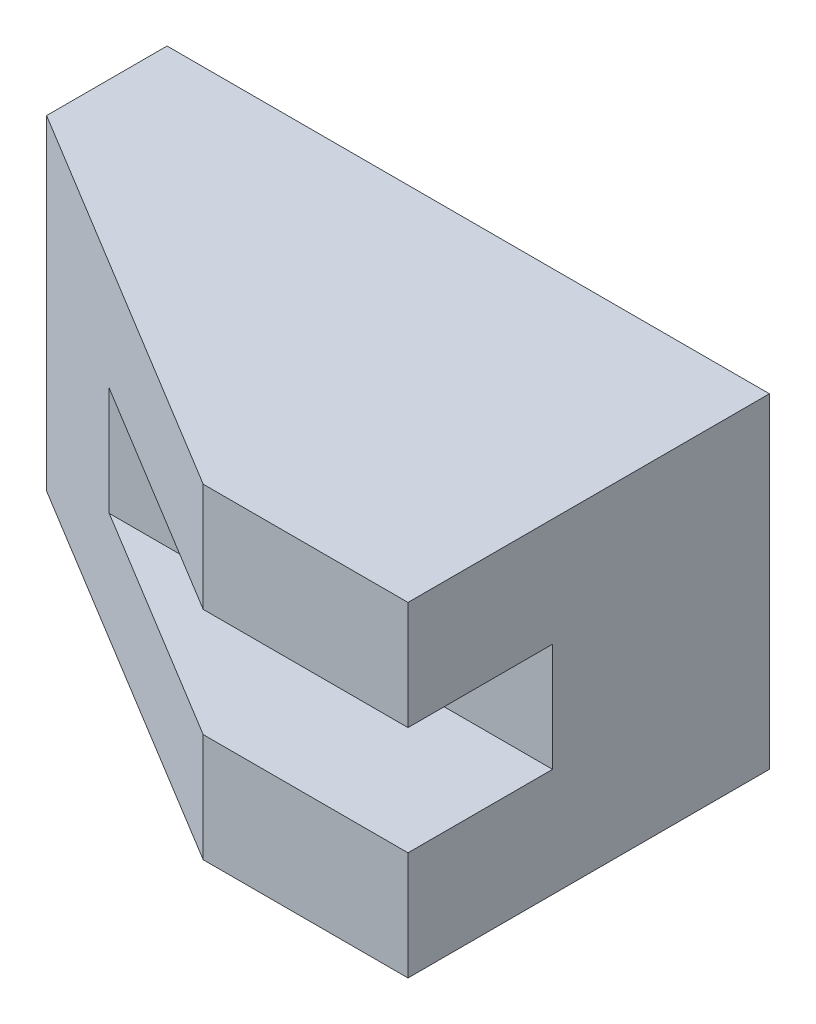
ISO-10303-21;
HEADER;
FILE_DESCRIPTION(('STEP AP214'),'2;1');
FILE_NAME('part.step','',(''),(''),'','','');
FILE_SCHEMA(('AUTOMOTIVE_DESIGN { 1 0 10303 214 1 1 1 1 }'));
ENDSEC;
DATA;
#1=APPLICATION_CONTEXT('core data for automotive mechanical design processes');
#2=APPLICATION_PROTOCOL_DEFINITION('international standard','automotive_design',2000,#1);
#3=PRODUCT_CONTEXT('',#1,'mechanical');
#4=PRODUCT('Part','Part','',(#3));
#5=PRODUCT_RELATED_PRODUCT_CATEGORY('part','',(#4));
#6=PRODUCT_DEFINITION_FORMATION('','',#4);
#7=PRODUCT_DEFINITION_CONTEXT('part definition',#1,'design');
#8=PRODUCT_DEFINITION('design','',#6,#7);
#9=PRODUCT_DEFINITION_SHAPE('','',#8);
#10=(LENGTH_UNIT() NAMED_UNIT(*) SI_UNIT(.MILLI.,.METRE.));
#11=(NAMED_UNIT(*) PLANE_ANGLE_UNIT() SI_UNIT($,.RADIAN.));
#12=(NAMED_UNIT(*) SI_UNIT($,.STERADIAN.) SOLID_ANGLE_UNIT());
#13=UNCERTAINTY_MEASURE_WITH_UNIT(LENGTH_MEASURE(1.E-05),#10,'distance_accuracy_value','');
#14=(GEOMETRIC_REPRESENTATION_CONTEXT(3) GLOBAL_UNCERTAINTY_ASSIGNED_CONTEXT((#13)) GLOBAL_UNIT_ASSIGNED_CONTEXT((#10,
#11,#12)) REPRESENTATION_CONTEXT('',''));
#15=CARTESIAN_POINT('',(0.,0.,0.));
#16=DIRECTION('',(0.,0.,1.));
#17=DIRECTION('',(1.,0.,0.));
#18=AXIS2_PLACEMENT_3D('',#15,#16,#17);
#19=CARTESIAN_POINT('',(-8.86501007387508,0.,14.6272666218939));
#20=DIRECTION('',(-0.518301716093344,0.,0.855197831554018));
#21=DIRECTION('',(0.855197831554018,0.,0.518301716093344));
#22=AXIS2_PLACEMENT_3D('',#19,#20,#21);
#23=PLANE('',#22);
#24=DIRECTION('',(0.,-1.,0.));
#25=VECTOR('',#24,1.);
#26=CARTESIAN_POINT('',(26.4,0.,36.));
#27=LINE('',#26,#25);
#28=CARTESIAN_POINT('',(26.4,36.,36.));
#29=VERTEX_POINT('',#28);
#30=CARTESIAN_POINT('',(26.4,18.,36.));
#31=VERTEX_POINT('',#30);
#32=EDGE_CURVE('E155',#29,#31,#27,.T.);
#33=ORIENTED_EDGE('',*,*,#32,.F.);
#34=DIRECTION('',(0.855197831554018,0.,0.518301716093344));
#35=VECTOR('',#34,1.);
#36=CARTESIAN_POINT('',(-8.86501007387508,36.,14.6272666218939));
#37=LINE('',#36,#35);
#38=CARTESIAN_POINT('',(66.,36.,60.));
#39=VERTEX_POINT('',#38);
#40=EDGE_CURVE('E141',#29,#39,#37,.T.);
#41=ORIENTED_EDGE('',*,*,#40,.T.);
#42=CARTESIAN_POINT('',(66.,36.,60.));
#43=DIRECTION('',(0.,1.,0.));
#44=VECTOR('',#43,1.);
#45=LINE('',#42,#44);
#46=CARTESIAN_POINT('',(66.,54.,60.));
#47=VERTEX_POINT('',#46);
#48=EDGE_CURVE('E334',#39,#47,#45,.T.);
#49=ORIENTED_EDGE('',*,*,#48,.T.);
#50=DIRECTION('',(-0.855197831554018,0.,-0.518301716093344));
#51=VECTOR('',#50,1.);
#52=CARTESIAN_POINT('',(66.,54.,60.));
#53=LINE('',#52,#51);
#54=CARTESIAN_POINT('',(0.,54.,20.));
#55=VERTEX_POINT('',#54);
#56=EDGE_CURVE('E226',#47,#55,#53,.T.);
#57=ORIENTED_EDGE('',*,*,#56,.T.);
#58=CARTESIAN_POINT('',(0.,0.,20.));
#59=DIRECTION('',(0.,1.,0.));
#60=VECTOR('',#59,1.);
#61=LINE('',#58,#60);
#62=CARTESIAN_POINT('',(0.,0.,20.));
#63=VERTEX_POINT('',#62);
#64=EDGE_CURVE('E90',#63,#55,#61,.T.);
#65=ORIENTED_EDGE('',*,*,#64,.F.);
#66=DIRECTION('',(-0.855197831554018,0.,-0.518301716093344));
#67=VECTOR('',#66,1.);
#68=CARTESIAN_POINT('',(66.,0.,60.));
#69=LINE('',#68,#67);
#70=CARTESIAN_POINT('',(66.,0.,60.));
#71=VERTEX_POINT('',#70);
#72=EDGE_CURVE('E337',#71,#63,#69,.T.);
#73=ORIENTED_EDGE('',*,*,#72,.F.);
#74=CARTESIAN_POINT('',(66.,0.,60.));
#75=DIRECTION('',(0.,1.,0.));
#76=VECTOR('',#75,1.);
#77=LINE('',#74,#76);
#78=CARTESIAN_POINT('',(66.,18.,60.));
#79=VERTEX_POINT('',#78);
#80=EDGE_CURVE('E330',#71,#79,#77,.T.);
#81=ORIENTED_EDGE('',*,*,#80,.T.);
#82=DIRECTION('',(0.855197831554018,0.,0.518301716093344));
#83=VECTOR('',#82,1.);
#84=CARTESIAN_POINT('',(-8.86501007387508,18.,14.6272666218939));
#85=LINE('',#84,#83);
#86=EDGE_CURVE('E162',#31,#79,#85,.T.);
#87=ORIENTED_EDGE('',*,*,#86,.F.);
#88=EDGE_LOOP('',(#33,#41,#49,#57,#65,#73,#81,#87));
#89=FACE_BOUND('',#88,.T.);
#90=ADVANCED_FACE('F63',(#89),#23,.T.);
#91=CARTESIAN_POINT('',(0.,0.,60.));
#92=DIRECTION('',(0.,0.,1.));
#93=DIRECTION('',(1.,0.,0.));
#94=AXIS2_PLACEMENT_3D('',#91,#92,#93);
#95=PLANE('',#94);
#96=ORIENTED_EDGE('',*,*,#48,.F.);
#97=DIRECTION('',(1.,0.,0.));
#98=VECTOR('',#97,1.);
#99=CARTESIAN_POINT('',(0.,36.,60.));
#100=LINE('',#99,#98);
#101=CARTESIAN_POINT('',(100.,36.,60.));
#102=VERTEX_POINT('',#101);
#103=EDGE_CURVE('E147',#39,#102,#100,.T.);
#104=ORIENTED_EDGE('',*,*,#103,.T.);
#105=CARTESIAN_POINT('',(100.,36.,60.));
#106=DIRECTION('',(0.,1.,0.));
#107=VECTOR('',#106,1.);
#108=LINE('',#105,#107);
#109=CARTESIAN_POINT('',(100.,54.,60.));
#110=VERTEX_POINT('',#109);
#111=EDGE_CURVE('E327',#102,#110,#108,.T.);
#112=ORIENTED_EDGE('',*,*,#111,.T.);
#113=DIRECTION('',(-1.,0.,0.));
#114=VECTOR('',#113,1.);
#115=CARTESIAN_POINT('',(100.,54.,60.));
#116=LINE('',#115,#114);
#117=EDGE_CURVE('E387',#110,#47,#116,.T.);
#118=ORIENTED_EDGE('',*,*,#117,.T.);
#119=EDGE_LOOP('',(#96,#104,#112,#118));
#120=FACE_BOUND('',#119,.T.);
#121=ADVANCED_FACE('F241',(#120),#95,.T.);
#122=CARTESIAN_POINT('',(100.,0.,0.));
#123=DIRECTION('',(1.,0.,0.));
#124=DIRECTION('',(0.,0.,-1.));
#125=AXIS2_PLACEMENT_3D('',#122,#123,#124);
#126=PLANE('',#125);
#127=ORIENTED_EDGE('',*,*,#111,.F.);
#128=DIRECTION('',(0.,0.,-1.));
#129=VECTOR('',#128,1.);
#130=CARTESIAN_POINT('',(100.,36.,0.));
#131=LINE('',#130,#129);
#132=CARTESIAN_POINT('',(100.,36.,36.));
#133=VERTEX_POINT('',#132);
#134=EDGE_CURVE('E12',#102,#133,#131,.T.);
#135=ORIENTED_EDGE('',*,*,#134,.T.);
#136=DIRECTION('',(0.,1.,0.));
#137=VECTOR('',#136,1.);
#138=CARTESIAN_POINT('',(100.,0.,36.));
#139=LINE('',#138,#137);
#140=CARTESIAN_POINT('',(100.,18.,36.));
#141=VERTEX_POINT('',#140);
#142=EDGE_CURVE('E157',#141,#133,#139,.T.);
#143=ORIENTED_EDGE('',*,*,#142,.F.);
#144=DIRECTION('',(0.,0.,-1.));
#145=VECTOR('',#144,1.);
#146=CARTESIAN_POINT('',(100.,18.,0.));
#147=LINE('',#146,#145);
#148=CARTESIAN_POINT('',(100.,18.,60.));
#149=VERTEX_POINT('',#148);
#150=EDGE_CURVE('E74',#149,#141,#147,.T.);
#151=ORIENTED_EDGE('',*,*,#150,.F.);
#152=CARTESIAN_POINT('',(100.,0.,60.));
#153=DIRECTION('',(0.,1.,0.));
#154=VECTOR('',#153,1.);
#155=LINE('',#152,#154);
#156=CARTESIAN_POINT('',(100.,0.,60.));
#157=VERTEX_POINT('',#156);
#158=EDGE_CURVE('E324',#157,#149,#155,.T.);
#159=ORIENTED_EDGE('',*,*,#158,.F.);
#160=DIRECTION('',(0.,0.,1.));
#161=VECTOR('',#160,1.);
#162=CARTESIAN_POINT('',(100.,0.,0.));
#163=LINE('',#162,#161);
#164=CARTESIAN_POINT('',(100.,0.,0.));
#165=VERTEX_POINT('',#164);
#166=EDGE_CURVE('E286',#165,#157,#163,.T.);
#167=ORIENTED_EDGE('',*,*,#166,.F.);
#168=CARTESIAN_POINT('',(100.,0.,0.));
#169=DIRECTION('',(0.,1.,0.));
#170=VECTOR('',#169,1.);
#171=LINE('',#168,#170);
#172=CARTESIAN_POINT('',(100.,54.,0.));
#173=VERTEX_POINT('',#172);
#174=EDGE_CURVE('E316',#165,#173,#171,.T.);
#175=ORIENTED_EDGE('',*,*,#174,.T.);
#176=DIRECTION('',(0.,0.,1.));
#177=VECTOR('',#176,1.);
#178=CARTESIAN_POINT('',(100.,54.,0.));
#179=LINE('',#178,#177);
#180=EDGE_CURVE('E318',#173,#110,#179,.T.);
#181=ORIENTED_EDGE('',*,*,#180,.T.);
#182=EDGE_LOOP('',(#127,#135,#143,#151,#159,#167,#175,#181));
#183=FACE_BOUND('',#182,.T.);
#184=ADVANCED_FACE('F291',(#183),#126,.T.);
#185=CARTESIAN_POINT('',(0.,54.,0.));
#186=DIRECTION('',(0.,-1.,0.));
#187=DIRECTION('',(0.,0.,-1.));
#188=AXIS2_PLACEMENT_3D('',#185,#186,#187);
#189=PLANE('',#188);
#190=DIRECTION('',(0.,0.,-1.));
#191=VECTOR('',#190,1.);
#192=CARTESIAN_POINT('',(0.,54.,20.));
#193=LINE('',#192,#191);
#194=CARTESIAN_POINT('',(0.,54.,0.));
#195=VERTEX_POINT('',#194);
#196=EDGE_CURVE('E323',#55,#195,#193,.T.);
#197=ORIENTED_EDGE('',*,*,#196,.F.);
#198=ORIENTED_EDGE('',*,*,#56,.F.);
#199=ORIENTED_EDGE('',*,*,#117,.F.);
#200=ORIENTED_EDGE('',*,*,#180,.F.);
#201=DIRECTION('',(1.,0.,0.));
#202=VECTOR('',#201,1.);
#203=CARTESIAN_POINT('',(0.,54.,0.));
#204=LINE('',#203,#202);
#205=EDGE_CURVE('E325',#195,#173,#204,.T.);
#206=ORIENTED_EDGE('',*,*,#205,.F.);
#207=EDGE_LOOP('',(#197,#198,#199,#200,#206));
#208=FACE_BOUND('',#207,.T.);
#209=ADVANCED_FACE('F65',(#208),#189,.F.);
#210=CARTESIAN_POINT('',(0.,0.,0.));
#211=DIRECTION('',(0.,-1.,0.));
#212=DIRECTION('',(0.,0.,-1.));
#213=AXIS2_PLACEMENT_3D('',#210,#211,#212);
#214=PLANE('',#213);
#215=DIRECTION('',(0.,0.,-1.));
#216=VECTOR('',#215,1.);
#217=CARTESIAN_POINT('',(0.,0.,20.));
#218=LINE('',#217,#216);
#219=CARTESIAN_POINT('',(0.,0.,0.));
#220=VERTEX_POINT('',#219);
#221=EDGE_CURVE('E151',#63,#220,#218,.T.);
#222=ORIENTED_EDGE('',*,*,#221,.T.);
#223=DIRECTION('',(1.,0.,0.));
#224=VECTOR('',#223,1.);
#225=CARTESIAN_POINT('',(0.,0.,0.));
#226=LINE('',#225,#224);
#227=EDGE_CURVE('E363',#220,#165,#226,.T.);
#228=ORIENTED_EDGE('',*,*,#227,.T.);
#229=ORIENTED_EDGE('',*,*,#166,.T.);
#230=DIRECTION('',(-1.,0.,0.));
#231=VECTOR('',#230,1.);
#232=CARTESIAN_POINT('',(100.,0.,60.));
#233=LINE('',#232,#231);
#234=EDGE_CURVE('E272',#157,#71,#233,.T.);
#235=ORIENTED_EDGE('',*,*,#234,.T.);
#236=ORIENTED_EDGE('',*,*,#72,.T.);
#237=EDGE_LOOP('',(#222,#228,#229,#235,#236));
#238=FACE_BOUND('',#237,.T.);
#239=ADVANCED_FACE('F201',(#238),#214,.T.);
#240=CARTESIAN_POINT('',(0.,0.,0.));
#241=DIRECTION('',(-1.,0.,0.));
#242=DIRECTION('',(0.,0.,1.));
#243=AXIS2_PLACEMENT_3D('',#240,#241,#242);
#244=PLANE('',#243);
#245=ORIENTED_EDGE('',*,*,#64,.T.);
#246=ORIENTED_EDGE('',*,*,#196,.T.);
#247=CARTESIAN_POINT('',(0.,0.,0.));
#248=DIRECTION('',(0.,1.,0.));
#249=VECTOR('',#248,1.);
#250=LINE('',#247,#249);
#251=EDGE_CURVE('E184',#220,#195,#250,.T.);
#252=ORIENTED_EDGE('',*,*,#251,.F.);
#253=ORIENTED_EDGE('',*,*,#221,.F.);
#254=EDGE_LOOP('',(#245,#246,#252,#253));
#255=FACE_BOUND('',#254,.T.);
#256=ADVANCED_FACE('F190',(#255),#244,.T.);
#257=CARTESIAN_POINT('',(0.,0.,0.));
#258=DIRECTION('',(0.,0.,-1.));
#259=DIRECTION('',(-1.,0.,0.));
#260=AXIS2_PLACEMENT_3D('',#257,#258,#259);
#261=PLANE('',#260);
#262=ORIENTED_EDGE('',*,*,#251,.T.);
#263=ORIENTED_EDGE('',*,*,#205,.T.);
#264=ORIENTED_EDGE('',*,*,#174,.F.);
#265=ORIENTED_EDGE('',*,*,#227,.F.);
#266=EDGE_LOOP('',(#262,#263,#264,#265));
#267=FACE_BOUND('',#266,.T.);
#268=ADVANCED_FACE('F200',(#267),#261,.T.);
#269=DIRECTION('',(1.,0.,0.));
#270=VECTOR('',#269,1.);
#271=CARTESIAN_POINT('',(0.,18.,60.));
#272=LINE('',#271,#270);
#273=EDGE_CURVE('E163',#79,#149,#272,.T.);
#274=ORIENTED_EDGE('',*,*,#273,.F.);
#275=ORIENTED_EDGE('',*,*,#80,.F.);
#276=ORIENTED_EDGE('',*,*,#234,.F.);
#277=ORIENTED_EDGE('',*,*,#158,.T.);
#278=EDGE_LOOP('',(#274,#275,#276,#277));
#279=FACE_BOUND('',#278,.T.);
#280=ADVANCED_FACE('F242',(#279),#95,.T.);
#281=CARTESIAN_POINT('',(0.,36.,0.));
#282=DIRECTION('',(0.,-1.,0.));
#283=DIRECTION('',(0.,0.,-1.));
#284=AXIS2_PLACEMENT_3D('',#281,#282,#283);
#285=PLANE('',#284);
#286=DIRECTION('',(1.,0.,0.));
#287=VECTOR('',#286,1.);
#288=CARTESIAN_POINT('',(-10.,36.,36.));
#289=LINE('',#288,#287);
#290=EDGE_CURVE('E144',#29,#133,#289,.T.);
#291=ORIENTED_EDGE('',*,*,#290,.T.);
#292=ORIENTED_EDGE('',*,*,#134,.F.);
#293=ORIENTED_EDGE('',*,*,#103,.F.);
#294=ORIENTED_EDGE('',*,*,#40,.F.);
#295=EDGE_LOOP('',(#291,#292,#293,#294));
#296=FACE_BOUND('',#295,.T.);
#297=ADVANCED_FACE('F143',(#296),#285,.T.);
#298=CARTESIAN_POINT('',(0.,18.,0.));
#299=DIRECTION('',(0.,-1.,0.));
#300=DIRECTION('',(0.,0.,-1.));
#301=AXIS2_PLACEMENT_3D('',#298,#299,#300);
#302=PLANE('',#301);
#303=ORIENTED_EDGE('',*,*,#86,.T.);
#304=ORIENTED_EDGE('',*,*,#273,.T.);
#305=ORIENTED_EDGE('',*,*,#150,.T.);
#306=DIRECTION('',(1.,0.,0.));
#307=VECTOR('',#306,1.);
#308=CARTESIAN_POINT('',(-10.,18.,36.));
#309=LINE('',#308,#307);
#310=EDGE_CURVE('E68',#31,#141,#309,.T.);
#311=ORIENTED_EDGE('',*,*,#310,.F.);
#312=EDGE_LOOP('',(#303,#304,#305,#311));
#313=FACE_BOUND('',#312,.T.);
#314=ADVANCED_FACE('F446',(#313),#302,.F.);
#315=CARTESIAN_POINT('',(0.,0.,36.));
#316=DIRECTION('',(0.,0.,-1.));
#317=DIRECTION('',(-1.,0.,0.));
#318=AXIS2_PLACEMENT_3D('',#315,#316,#317);
#319=PLANE('',#318);
#320=ORIENTED_EDGE('',*,*,#32,.T.);
#321=ORIENTED_EDGE('',*,*,#310,.T.);
#322=ORIENTED_EDGE('',*,*,#142,.T.);
#323=ORIENTED_EDGE('',*,*,#290,.F.);
#324=EDGE_LOOP('',(#320,#321,#322,#323));
#325=FACE_BOUND('',#324,.T.);
#326=ADVANCED_FACE('F154',(#325),#319,.F.);
#327=CLOSED_SHELL('',(#90,#121,#184,#209,#239,#256,#268,#280,#297,#314,#326));
#328=MANIFOLD_SOLID_BREP('B2',#327);
#329=ADVANCED_BREP_SHAPE_REPRESENTATION('',(#18,#328),#14);
#330=SHAPE_DEFINITION_REPRESENTATION(#9,#329);
ENDSEC;
END-ISO-10303-21;
